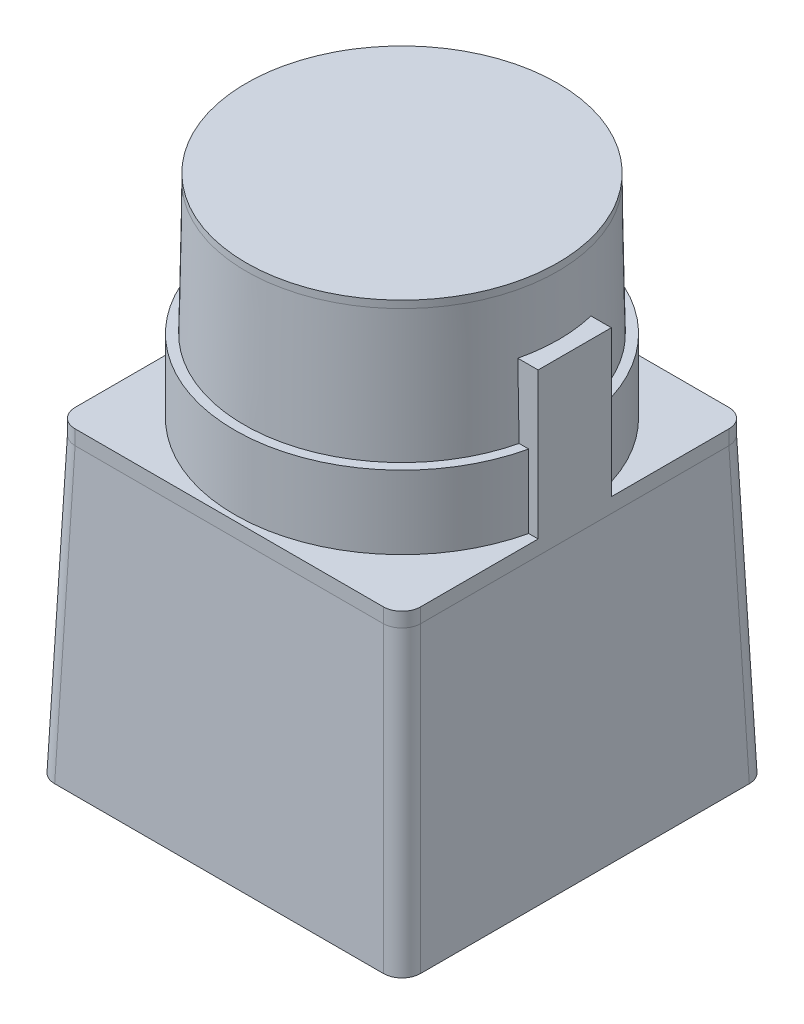
ISO-10303-21;
HEADER;
FILE_DESCRIPTION(('STEP AP214'),'2;1');
FILE_NAME('part.step','',(''),(''),'','','');
FILE_SCHEMA(('AUTOMOTIVE_DESIGN { 1 0 10303 214 1 1 1 1 }'));
ENDSEC;
DATA;
#1=APPLICATION_CONTEXT('core data for automotive mechanical design processes');
#2=APPLICATION_PROTOCOL_DEFINITION('international standard','automotive_design',2000,#1);
#3=PRODUCT_CONTEXT('',#1,'mechanical');
#4=PRODUCT('Part','Part','',(#3));
#5=PRODUCT_RELATED_PRODUCT_CATEGORY('part','',(#4));
#6=PRODUCT_DEFINITION_FORMATION('','',#4);
#7=PRODUCT_DEFINITION_CONTEXT('part definition',#1,'design');
#8=PRODUCT_DEFINITION('design','',#6,#7);
#9=PRODUCT_DEFINITION_SHAPE('','',#8);
#10=(LENGTH_UNIT() NAMED_UNIT(*) SI_UNIT(.MILLI.,.METRE.));
#11=(NAMED_UNIT(*) PLANE_ANGLE_UNIT() SI_UNIT($,.RADIAN.));
#12=(NAMED_UNIT(*) SI_UNIT($,.STERADIAN.) SOLID_ANGLE_UNIT());
#13=UNCERTAINTY_MEASURE_WITH_UNIT(LENGTH_MEASURE(1.E-05),#10,'distance_accuracy_value','');
#14=(GEOMETRIC_REPRESENTATION_CONTEXT(3) GLOBAL_UNCERTAINTY_ASSIGNED_CONTEXT((#13)) GLOBAL_UNIT_ASSIGNED_CONTEXT((#10,
#11,#12)) REPRESENTATION_CONTEXT('',''));
#15=CARTESIAN_POINT('',(0.,0.,0.));
#16=DIRECTION('',(0.,0.,1.));
#17=DIRECTION('',(1.,0.,0.));
#18=AXIS2_PLACEMENT_3D('',#15,#16,#17);
#19=CARTESIAN_POINT('',(-23.6031692274,41.9999999978,23.6031692274));
#20=DIRECTION('',(0.,-1.,0.));
#21=DIRECTION('',(0.,0.,-1.));
#22=AXIS2_PLACEMENT_3D('',#19,#20,#21);
#23=PLANE('',#22);
#24=DIRECTION('',(-1.,0.,0.));
#25=VECTOR('',#24,1.);
#26=CARTESIAN_POINT('',(23.6031692274,41.9999999978,-5.));
#27=LINE('',#26,#25);
#28=CARTESIAN_POINT('',(23.6031692274,41.9999999978,-5.));
#29=VERTEX_POINT('',#28);
#30=CARTESIAN_POINT('',(22.306492328468,41.9999999978,-5.));
#31=VERTEX_POINT('',#30);
#32=EDGE_CURVE('E62',#29,#31,#27,.T.);
#33=ORIENTED_EDGE('',*,*,#32,.F.);
#34=DIRECTION('',(0.,0.,1.));
#35=VECTOR('',#34,1.);
#36=CARTESIAN_POINT('',(23.6031692274,41.9999999978,0.));
#37=LINE('',#36,#35);
#38=CARTESIAN_POINT('',(23.6031692274,41.9999999978,-21.0631692274));
#39=VERTEX_POINT('',#38);
#40=EDGE_CURVE('E223',#39,#29,#37,.T.);
#41=ORIENTED_EDGE('',*,*,#40,.F.);
#42=CARTESIAN_POINT('',(21.0631692274,41.9999999978,-21.0631692274));
#43=DIRECTION('',(0.,-1.,0.));
#44=DIRECTION('',(1.,0.,0.));
#45=AXIS2_PLACEMENT_3D('',#42,#43,#44);
#46=CIRCLE('',#45,2.54);
#47=CARTESIAN_POINT('',(21.0631692274,41.9999999978,-23.6031692274));
#48=VERTEX_POINT('',#47);
#49=EDGE_CURVE('E327',#48,#39,#46,.T.);
#50=ORIENTED_EDGE('',*,*,#49,.F.);
#51=DIRECTION('',(1.,0.,0.));
#52=VECTOR('',#51,1.);
#53=CARTESIAN_POINT('',(0.,41.9999999978,-23.6031692274));
#54=LINE('',#53,#52);
#55=CARTESIAN_POINT('',(-21.0631692274,41.9999999978,-23.6031692274));
#56=VERTEX_POINT('',#55);
#57=EDGE_CURVE('E329',#56,#48,#54,.T.);
#58=ORIENTED_EDGE('',*,*,#57,.F.);
#59=CARTESIAN_POINT('',(-21.0631692274,41.9999999978,-21.0631692274));
#60=DIRECTION('',(0.,-1.,0.));
#61=DIRECTION('',(1.,0.,0.));
#62=AXIS2_PLACEMENT_3D('',#59,#60,#61);
#63=CIRCLE('',#62,2.54);
#64=CARTESIAN_POINT('',(-23.6031692274,41.9999999978,-21.0631692269114));
#65=VERTEX_POINT('',#64);
#66=EDGE_CURVE('E330',#65,#56,#63,.T.);
#67=ORIENTED_EDGE('',*,*,#66,.F.);
#68=DIRECTION('',(0.,0.,-1.));
#69=VECTOR('',#68,1.);
#70=CARTESIAN_POINT('',(-23.6031692274,41.9999999978,0.));
#71=LINE('',#70,#69);
#72=CARTESIAN_POINT('',(-23.6031692274,41.9999999978,21.0631692274));
#73=VERTEX_POINT('',#72);
#74=EDGE_CURVE('E332',#73,#65,#71,.T.);
#75=ORIENTED_EDGE('',*,*,#74,.F.);
#76=CARTESIAN_POINT('',(-21.0631692274,41.9999999978,21.0631692274));
#77=DIRECTION('',(0.,-1.,0.));
#78=DIRECTION('',(1.,0.,0.));
#79=AXIS2_PLACEMENT_3D('',#76,#77,#78);
#80=CIRCLE('',#79,2.54);
#81=CARTESIAN_POINT('',(-21.063169227921,41.9999999978,23.6031692274));
#82=VERTEX_POINT('',#81);
#83=EDGE_CURVE('E333',#82,#73,#80,.T.);
#84=ORIENTED_EDGE('',*,*,#83,.F.);
#85=DIRECTION('',(-1.,0.,0.));
#86=VECTOR('',#85,1.);
#87=CARTESIAN_POINT('',(0.,41.9999999978,23.6031692274));
#88=LINE('',#87,#86);
#89=CARTESIAN_POINT('',(21.0631692274,41.9999999978,23.6031692274));
#90=VERTEX_POINT('',#89);
#91=EDGE_CURVE('E335',#90,#82,#88,.T.);
#92=ORIENTED_EDGE('',*,*,#91,.F.);
#93=CARTESIAN_POINT('',(21.0631692274,41.9999999978,21.0631692274));
#94=DIRECTION('',(0.,-1.,0.));
#95=DIRECTION('',(1.,0.,0.));
#96=AXIS2_PLACEMENT_3D('',#93,#94,#95);
#97=CIRCLE('',#96,2.54);
#98=CARTESIAN_POINT('',(23.6031692274,41.9999999978,21.0631692274));
#99=VERTEX_POINT('',#98);
#100=EDGE_CURVE('E336',#99,#90,#97,.T.);
#101=ORIENTED_EDGE('',*,*,#100,.F.);
#102=CARTESIAN_POINT('',(23.6031692274,41.9999999978,5.));
#103=VERTEX_POINT('',#102);
#104=EDGE_CURVE('E55',#103,#99,#37,.T.);
#105=ORIENTED_EDGE('',*,*,#104,.F.);
#106=DIRECTION('',(1.,0.,0.));
#107=VECTOR('',#106,1.);
#108=CARTESIAN_POINT('',(23.6031692274,41.9999999978,5.));
#109=LINE('',#108,#107);
#110=CARTESIAN_POINT('',(22.306492328468,41.9999999978,5.));
#111=VERTEX_POINT('',#110);
#112=EDGE_CURVE('E219',#111,#103,#109,.T.);
#113=ORIENTED_EDGE('',*,*,#112,.F.);
#114=CARTESIAN_POINT('',(0.,41.9999999978,0.));
#115=DIRECTION('',(0.,-1.,0.));
#116=DIRECTION('',(0.,0.,-1.));
#117=AXIS2_PLACEMENT_3D('',#114,#115,#116);
#118=CIRCLE('',#117,22.86);
#119=EDGE_CURVE('E325',#111,#31,#118,.T.);
#120=ORIENTED_EDGE('',*,*,#119,.T.);
#121=EDGE_LOOP('',(#33,#41,#50,#58,#67,#75,#84,#92,#101,#105,#113,#120));
#122=FACE_BOUND('',#121,.T.);
#123=ADVANCED_FACE('F34',(#122),#23,.F.);
#124=CARTESIAN_POINT('',(0.,51.9999999876,0.));
#125=DIRECTION('',(0.,-1.,0.));
#126=DIRECTION('',(0.,0.,-1.));
#127=AXIS2_PLACEMENT_3D('',#124,#125,#126);
#128=CYLINDRICAL_SURFACE('',#127,22.86);
#129=DIRECTION('',(0.,-1.,0.));
#130=VECTOR('',#129,1.);
#131=CARTESIAN_POINT('',(22.306492328468,51.9999999876,-5.));
#132=LINE('',#131,#130);
#133=CARTESIAN_POINT('',(22.306492328468,51.9999999876,-5.));
#134=VERTEX_POINT('',#133);
#135=EDGE_CURVE('E236',#31,#134,#132,.F.);
#136=ORIENTED_EDGE('',*,*,#135,.F.);
#137=ORIENTED_EDGE('',*,*,#119,.F.);
#138=DIRECTION('',(0.,-1.,0.));
#139=VECTOR('',#138,1.);
#140=CARTESIAN_POINT('',(22.306492328468,51.9999999876,5.));
#141=LINE('',#140,#139);
#142=CARTESIAN_POINT('',(22.306492328468,51.9999999876,5.));
#143=VERTEX_POINT('',#142);
#144=EDGE_CURVE('E227',#143,#111,#141,.T.);
#145=ORIENTED_EDGE('',*,*,#144,.F.);
#146=CARTESIAN_POINT('',(0.,51.9999999876,0.));
#147=DIRECTION('',(0.,-1.,0.));
#148=DIRECTION('',(0.,0.,-1.));
#149=AXIS2_PLACEMENT_3D('',#146,#147,#148);
#150=CIRCLE('',#149,22.86);
#151=EDGE_CURVE('E321',#134,#143,#150,.F.);
#152=ORIENTED_EDGE('',*,*,#151,.F.);
#153=EDGE_LOOP('',(#136,#137,#145,#152));
#154=FACE_BOUND('',#153,.T.);
#155=ADVANCED_FACE('F590',(#154),#128,.T.);
#156=CARTESIAN_POINT('',(-23.13432,51.9999999876,-23.13432));
#157=DIRECTION('',(0.,1.,0.));
#158=DIRECTION('',(0.,0.,1.));
#159=AXIS2_PLACEMENT_3D('',#156,#157,#158);
#160=PLANE('',#159);
#161=CARTESIAN_POINT('',(0.,51.9999999876,0.));
#162=DIRECTION('',(0.,-1.,0.));
#163=DIRECTION('',(0.,0.,-1.));
#164=AXIS2_PLACEMENT_3D('',#161,#162,#163);
#165=CIRCLE('',#164,21.59);
#166=CARTESIAN_POINT('',(21.0030497785441,51.9999999876,5.));
#167=VERTEX_POINT('',#166);
#168=CARTESIAN_POINT('',(21.0030497785441,51.9999999876,-5.));
#169=VERTEX_POINT('',#168);
#170=EDGE_CURVE('E316',#167,#169,#165,.T.);
#171=ORIENTED_EDGE('',*,*,#170,.T.);
#172=DIRECTION('',(1.,0.,0.));
#173=VECTOR('',#172,1.);
#174=CARTESIAN_POINT('',(-23.13432,51.9999999876,-4.99999999999999));
#175=LINE('',#174,#173);
#176=EDGE_CURVE('E234',#169,#134,#175,.T.);
#177=ORIENTED_EDGE('',*,*,#176,.T.);
#178=ORIENTED_EDGE('',*,*,#151,.T.);
#179=DIRECTION('',(-1.,0.,0.));
#180=VECTOR('',#179,1.);
#181=CARTESIAN_POINT('',(-23.13432,51.9999999876,5.));
#182=LINE('',#181,#180);
#183=EDGE_CURVE('E224',#143,#167,#182,.T.);
#184=ORIENTED_EDGE('',*,*,#183,.T.);
#185=EDGE_LOOP('',(#171,#177,#178,#184));
#186=FACE_BOUND('',#185,.T.);
#187=ADVANCED_FACE('F595',(#186),#160,.T.);
#188=CARTESIAN_POINT('',(0.,70.0000000048,0.));
#189=DIRECTION('',(0.,-1.,0.));
#190=DIRECTION('',(0.,0.,-1.));
#191=AXIS2_PLACEMENT_3D('',#188,#189,#190);
#192=CONICAL_SURFACE('',#191,21.2758088326,0.0174532924306293);
#193=CARTESIAN_POINT('',(0.,70.0000000048,0.));
#194=DIRECTION('',(0.,-1.,0.));
#195=DIRECTION('',(0.,0.,-1.));
#196=AXIS2_PLACEMENT_3D('',#193,#194,#195);
#197=CIRCLE('',#196,21.2758088326);
#198=CARTESIAN_POINT('',(0.,70.0000000048,-21.2758088326));
#199=VERTEX_POINT('',#198);
#200=EDGE_CURVE('E310',#199,#199,#197,.T.);
#201=ORIENTED_EDGE('',*,*,#200,.T.);
#202=EDGE_LOOP('',(#201));
#203=FACE_BOUND('',#202,.T.);
#204=CARTESIAN_POINT('',(21.4118588894712,29.2043831627307,-5.));
#205=CARTESIAN_POINT('',(21.2680430061588,37.2279177932147,-5.));
#206=CARTESIAN_POINT('',(21.124147465659,45.2514509943208,-5.));
#207=CARTESIAN_POINT('',(20.8361970702838,61.2985145378097,-5.));
#208=CARTESIAN_POINT('',(20.6921422154084,69.3220448801925,-5.));
#209=CARTESIAN_POINT('',(20.5480077033457,77.3455737931973,-5.));
#210=B_SPLINE_CURVE_WITH_KNOTS('',3,(#204,#205,#206,#207,#208,#209),.UNSPECIFIED.,.F.,.F.,(4,2,
4),(0.,24.0744702662893,48.1489405326763),.UNSPECIFIED.);
#211=CARTESIAN_POINT('',(20.8235796856304,61.9999999978,-5.));
#212=VERTEX_POINT('',#211);
#213=EDGE_CURVE('E11',#169,#212,#210,.T.);
#214=ORIENTED_EDGE('',*,*,#213,.F.);
#215=ORIENTED_EDGE('',*,*,#170,.F.);
#216=CARTESIAN_POINT('',(20.5480077033457,77.3455737931973,5.));
#217=CARTESIAN_POINT('',(20.6921422154084,69.3220448801925,5.));
#218=CARTESIAN_POINT('',(20.8361970702838,61.2985145378097,5.));
#219=CARTESIAN_POINT('',(21.1241474656589,45.2514509943208,5.));
#220=CARTESIAN_POINT('',(21.2680430061588,37.2279177932147,5.));
#221=CARTESIAN_POINT('',(21.4118588894712,29.2043831627307,5.));
#222=B_SPLINE_CURVE_WITH_KNOTS('',3,(#216,#217,#218,#219,#220,#221),.UNSPECIFIED.,.F.,.F.,(4,2,
4),(0.,24.074470266387,48.1489405326763),.UNSPECIFIED.);
#223=CARTESIAN_POINT('',(20.8235796856304,61.9999999978,5.));
#224=VERTEX_POINT('',#223);
#225=EDGE_CURVE('E48',#224,#167,#222,.T.);
#226=ORIENTED_EDGE('',*,*,#225,.F.);
#227=CARTESIAN_POINT('',(0.,61.9999999978,0.));
#228=DIRECTION('',(0.,-1.,0.));
#229=DIRECTION('',(0.,0.,-1.));
#230=AXIS2_PLACEMENT_3D('',#227,#228,#229);
#231=CIRCLE('',#230,21.4154493514332);
#232=EDGE_CURVE('E418',#212,#224,#231,.T.);
#233=ORIENTED_EDGE('',*,*,#232,.F.);
#234=EDGE_LOOP('',(#214,#215,#226,#233));
#235=FACE_BOUND('',#234,.T.);
#236=ADVANCED_FACE('F398',(#203,#235),#192,.T.);
#237=CARTESIAN_POINT('',(-25.0000000126,0.,-25.0000000126));
#238=DIRECTION('',(0.,1.,0.));
#239=DIRECTION('',(0.,0.,1.));
#240=AXIS2_PLACEMENT_3D('',#237,#238,#239);
#241=PLANE('',#240);
#242=CARTESIAN_POINT('',(20.0000000075042,0.,-19.9999999942534));
#243=DIRECTION('',(0.,-1.,0.));
#244=DIRECTION('',(0.,0.,-1.));
#245=AXIS2_PLACEMENT_3D('',#242,#243,#244);
#246=CIRCLE('',#245,1.5);
#247=CARTESIAN_POINT('',(20.0000000075042,0.,-21.4999999942534));
#248=VERTEX_POINT('',#247);
#249=EDGE_CURVE('E239',#248,#248,#246,.T.);
#250=ORIENTED_EDGE('',*,*,#249,.F.);
#251=EDGE_LOOP('',(#250));
#252=FACE_BOUND('',#251,.T.);
#253=CARTESIAN_POINT('',(-20.0000000075042,0.,19.9999999942534));
#254=DIRECTION('',(0.,-1.,0.));
#255=DIRECTION('',(0.,0.,-1.));
#256=AXIS2_PLACEMENT_3D('',#253,#254,#255);
#257=CIRCLE('',#256,1.5000000071763);
#258=CARTESIAN_POINT('',(-20.0000000075042,0.,18.4999999870771));
#259=VERTEX_POINT('',#258);
#260=EDGE_CURVE('E243',#259,#259,#257,.T.);
#261=ORIENTED_EDGE('',*,*,#260,.F.);
#262=EDGE_LOOP('',(#261));
#263=FACE_BOUND('',#262,.T.);
#264=CARTESIAN_POINT('',(22.4584517485526,0.,-22.4584517485526));
#265=DIRECTION('',(0.,1.,0.));
#266=DIRECTION('',(0.707106781186554,0.,-0.707106781186541));
#267=AXIS2_PLACEMENT_3D('',#264,#265,#266);
#268=ELLIPSE('',#267,2.54309555493556,2.54000001245353);
#269=CARTESIAN_POINT('',(22.4615472930611,-9.89321471966953E-11,-25.0000000040941));
#270=VERTEX_POINT('',#269);
#271=CARTESIAN_POINT('',(25.0000000080669,0.,-22.4615472839286));
#272=VERTEX_POINT('',#271);
#273=EDGE_CURVE('E359',#270,#272,#268,.F.);
#274=ORIENTED_EDGE('',*,*,#273,.T.);
#275=DIRECTION('',(0.,0.,-1.));
#276=VECTOR('',#275,1.);
#277=CARTESIAN_POINT('',(25.0000000126,0.,0.));
#278=LINE('',#277,#276);
#279=CARTESIAN_POINT('',(24.9999999966763,0.,22.4615472839147));
#280=VERTEX_POINT('',#279);
#281=EDGE_CURVE('E284',#280,#272,#278,.T.);
#282=ORIENTED_EDGE('',*,*,#281,.F.);
#283=CARTESIAN_POINT('',(22.4584517485526,0.,22.4584517485526));
#284=DIRECTION('',(0.,1.,0.));
#285=DIRECTION('',(0.707106781186541,0.,0.707106781186554));
#286=AXIS2_PLACEMENT_3D('',#283,#284,#285);
#287=ELLIPSE('',#286,2.54309553214044,2.53999998968616);
#288=CARTESIAN_POINT('',(22.4615472839147,0.,24.9999999966763));
#289=VERTEX_POINT('',#288);
#290=EDGE_CURVE('E249',#280,#289,#287,.F.);
#291=ORIENTED_EDGE('',*,*,#290,.T.);
#292=DIRECTION('',(1.,0.,0.));
#293=VECTOR('',#292,1.);
#294=CARTESIAN_POINT('',(0.,0.,25.0000000126));
#295=LINE('',#294,#293);
#296=CARTESIAN_POINT('',(-22.4615473026752,0.,24.999999993184));
#297=VERTEX_POINT('',#296);
#298=EDGE_CURVE('E304',#297,#289,#295,.T.);
#299=ORIENTED_EDGE('',*,*,#298,.F.);
#300=CARTESIAN_POINT('',(-22.4584517573299,0.,22.45845175733));
#301=DIRECTION('',(0.,1.,0.));
#302=DIRECTION('',(-0.707106781186534,0.,0.707106781186561));
#303=AXIS2_PLACEMENT_3D('',#300,#301,#302);
#304=ELLIPSE('',#303,2.54309554092317,2.5399999984582);
#305=CARTESIAN_POINT('',(-25.0000000054537,0.,22.4615472883088));
#306=VERTEX_POINT('',#305);
#307=EDGE_CURVE('E371',#297,#306,#304,.F.);
#308=ORIENTED_EDGE('',*,*,#307,.T.);
#309=DIRECTION('',(0.,0.,1.));
#310=VECTOR('',#309,1.);
#311=CARTESIAN_POINT('',(-25.0000000126,0.,0.));
#312=LINE('',#311,#310);
#313=CARTESIAN_POINT('',(-24.999999993184,0.,-22.4615473026752));
#314=VERTEX_POINT('',#313);
#315=EDGE_CURVE('E299',#314,#306,#312,.T.);
#316=ORIENTED_EDGE('',*,*,#315,.F.);
#317=CARTESIAN_POINT('',(-22.45845175733,0.,-22.4584517573299));
#318=DIRECTION('',(0.,1.,0.));
#319=DIRECTION('',(-0.707106781186562,0.,-0.707106781186533));
#320=AXIS2_PLACEMENT_3D('',#317,#318,#319);
#321=ELLIPSE('',#320,2.54309554092317,2.5399999984582);
#322=CARTESIAN_POINT('',(-22.4615472883088,0.,-25.0000000054537));
#323=VERTEX_POINT('',#322);
#324=EDGE_CURVE('E365',#314,#323,#321,.F.);
#325=ORIENTED_EDGE('',*,*,#324,.T.);
#326=DIRECTION('',(-1.,0.,0.));
#327=VECTOR('',#326,1.);
#328=CARTESIAN_POINT('',(0.,0.,-25.0000000126));
#329=LINE('',#328,#327);
#330=EDGE_CURVE('E294',#270,#323,#329,.T.);
#331=ORIENTED_EDGE('',*,*,#330,.F.);
#332=EDGE_LOOP('',(#274,#282,#291,#299,#308,#316,#325,#331));
#333=FACE_BOUND('',#332,.T.);
#334=ADVANCED_FACE('F401',(#252,#263,#333),#241,.F.);
#335=CARTESIAN_POINT('',(21.056327374305,40.1515886999986,21.056327374305));
#336=DIRECTION('',(0.0348782627554634,-0.998782765957804,0.034878262755464));
#337=DIRECTION('',(0.,-0.0348994967156143,-0.999390827018638));
#338=AXIS2_PLACEMENT_3D('',#335,#336,#337);
#339=CYLINDRICAL_SURFACE('',#338,2.53999998968616);
#340=CARTESIAN_POINT('',(21.0631692274,39.9556636619195,21.0631692274));
#341=DIRECTION('',(0.0174444406774464,-0.999695645173521,0.0174444406774474));
#342=DIRECTION('',(-0.706891569824864,-0.0246701645940576,-0.70689156982485));
#343=AXIS2_PLACEMENT_3D('',#340,#341,#342);
#344=ELLIPSE('',#343,2.54077329145733,2.53999999484308);
#345=CARTESIAN_POINT('',(23.6031687608156,40.0000132547059,21.0647160031617));
#346=VERTEX_POINT('',#345);
#347=CARTESIAN_POINT('',(21.0647160566723,40.0000132490903,23.6031687500148));
#348=VERTEX_POINT('',#347);
#349=EDGE_CURVE('E351',#346,#348,#344,.T.);
#350=ORIENTED_EDGE('',*,*,#349,.T.);
#351=DIRECTION('',(-0.0348782621516423,0.998782765967756,-0.0348782630743116));
#352=VECTOR('',#351,1.);
#353=CARTESIAN_POINT('',(22.4615472773966,0.,25.0000000126));
#354=LINE('',#353,#352);
#355=EDGE_CURVE('E307',#289,#348,#354,.T.);
#356=ORIENTED_EDGE('',*,*,#355,.F.);
#357=ORIENTED_EDGE('',*,*,#290,.F.);
#358=DIRECTION('',(0.0348782630743116,-0.998782765967756,0.0348782621516423));
#359=VECTOR('',#358,1.);
#360=CARTESIAN_POINT('',(23.6031687487904,40.0000134836286,21.0647160505388));
#361=LINE('',#360,#359);
#362=EDGE_CURVE('E354',#346,#280,#361,.T.);
#363=ORIENTED_EDGE('',*,*,#362,.F.);
#364=EDGE_LOOP('',(#350,#356,#357,#363));
#365=FACE_BOUND('',#364,.T.);
#366=ADVANCED_FACE('F571',(#365),#339,.T.);
#367=CARTESIAN_POINT('',(-22.731085856,40.2400135762,23.5947877608));
#368=DIRECTION('',(0.,0.0348994970339201,0.999390827007522));
#369=DIRECTION('',(0.,-0.999390827007522,0.0348994970339201));
#370=AXIS2_PLACEMENT_3D('',#367,#368,#369);
#371=PLANE('',#370);
#372=DIRECTION('',(1.,0.,0.));
#373=VECTOR('',#372,1.);
#374=CARTESIAN_POINT('',(-22.731085856,40.0000067434264,23.6031689841634));
#375=LINE('',#374,#373);
#376=CARTESIAN_POINT('',(-21.0631692142941,40.0000033767132,23.6031691057817));
#377=VERTEX_POINT('',#376);
#378=CARTESIAN_POINT('',(-21.064716171992,40.0000100048208,23.6031688768194));
#379=VERTEX_POINT('',#378);
#380=EDGE_CURVE('E373',#377,#379,#375,.F.);
#381=ORIENTED_EDGE('',*,*,#380,.T.);
#382=DIRECTION('',(0.0348782628698957,0.998782765971677,-0.0348782622437629));
#383=VECTOR('',#382,1.);
#384=CARTESIAN_POINT('',(-21.7637714539054,19.9816859661939,24.3022241483629));
#385=LINE('',#384,#383);
#386=EDGE_CURVE('E370',#379,#297,#385,.F.);
#387=ORIENTED_EDGE('',*,*,#386,.T.);
#388=ORIENTED_EDGE('',*,*,#298,.T.);
#389=ORIENTED_EDGE('',*,*,#355,.T.);
#390=CARTESIAN_POINT('',(21.0647160557825,40.0000134955515,23.6031687564003));
#391=CARTESIAN_POINT('',(21.0646516045644,40.0000129336167,23.6031687956503));
#392=CARTESIAN_POINT('',(21.0645871533449,40.0000123716819,23.6031688324472));
#393=CARTESIAN_POINT('',(21.0644582509032,40.0000112478122,23.6031689011347));
#394=CARTESIAN_POINT('',(21.064393799681,40.0000106858774,23.6031689330253));
#395=CARTESIAN_POINT('',(21.0642648972345,40.0000095620077,23.6031689919003));
#396=CARTESIAN_POINT('',(21.0642004460101,40.0000090000729,23.6031690188847));
#397=CARTESIAN_POINT('',(21.0640715435594,40.0000078762032,23.6031690679471));
#398=CARTESIAN_POINT('',(21.0640070923331,40.0000073142684,23.6031690900253));
#399=CARTESIAN_POINT('',(21.0638781898791,40.0000061903987,23.6031691292752));
#400=CARTESIAN_POINT('',(21.0638137386514,40.0000056284639,23.6031691464471));
#401=CARTESIAN_POINT('',(21.0636848361947,40.0000045045942,23.6031691758846));
#402=CARTESIAN_POINT('',(21.0636203849658,40.0000039426594,23.6031691881502));
#403=CARTESIAN_POINT('',(21.0634914825073,40.0000028187897,23.6031692077751));
#404=CARTESIAN_POINT('',(21.0634270312777,40.0000022568549,23.6031692151345));
#405=CARTESIAN_POINT('',(21.0632981288181,40.0000011329852,23.6031692249469));
#406=CARTESIAN_POINT('',(21.0632336775881,40.0000005710504,23.6031692274));
#407=CARTESIAN_POINT('',(21.0631692263581,40.0000000091156,23.6031692274));
#408=B_SPLINE_CURVE_WITH_KNOTS('',3,(#390,#391,#392,#393,#394,#395,#396,#397,#398,#399,#400,
#401,#402,#403,#404,#405,#406,#407),.UNSPECIFIED.,.F.,.F.,(4,2,2,2,2,2,2,2,4),(0.,
0.000193361038873821,0.000386722077752431,0.000580083116628768,0.000773444155502519,
0.000966805194380497,0.00116016623325558,0.0013535272721311,0.00154688831101022),.UNSPECIFIED.);
#409=CARTESIAN_POINT('',(21.0631692270527,40.0000000097052,23.6031692274));
#410=VERTEX_POINT('',#409);
#411=EDGE_CURVE('E282',#348,#410,#408,.T.);
#412=ORIENTED_EDGE('',*,*,#411,.T.);
#413=DIRECTION('',(-1.,0.,0.));
#414=VECTOR('',#413,1.);
#415=CARTESIAN_POINT('',(0.,40.00000001,23.6031692274));
#416=LINE('',#415,#414);
#417=EDGE_CURVE('E447',#410,#377,#416,.T.);
#418=ORIENTED_EDGE('',*,*,#417,.T.);
#419=EDGE_LOOP('',(#381,#387,#388,#389,#412,#418));
#420=FACE_BOUND('',#419,.T.);
#421=ADVANCED_FACE('F578',(#420),#371,.T.);
#422=CARTESIAN_POINT('',(-21.056327383061,40.1515887006102,21.056327383061));
#423=DIRECTION('',(-0.0348782627554633,-0.998782765957804,0.0348782627554647));
#424=DIRECTION('',(0.,-0.034899496715615,-0.999390827018638));
#425=AXIS2_PLACEMENT_3D('',#422,#423,#424);
#426=CYLINDRICAL_SURFACE('',#425,2.5399999984582);
#427=CARTESIAN_POINT('',(-21.0631692274,39.9556639132704,21.0631692274));
#428=DIRECTION('',(-0.0174444406774478,-0.999695645173521,0.0174444406774478));
#429=DIRECTION('',(0.70689156982483,-0.0246701645940583,-0.706891569824885));
#430=AXIS2_PLACEMENT_3D('',#427,#428,#429);
#431=ELLIPSE('',#430,2.54077329584468,2.5399999992291);
#432=CARTESIAN_POINT('',(-23.6031687522092,40.0000133747624,21.0647160542866));
#433=VERTEX_POINT('',#432);
#434=EDGE_CURVE('E347',#379,#433,#431,.T.);
#435=ORIENTED_EDGE('',*,*,#434,.T.);
#436=DIRECTION('',(0.0348782630743116,0.998782765967756,-0.0348782621516423));
#437=VECTOR('',#436,1.);
#438=CARTESIAN_POINT('',(-25.0000000126,0.,22.4615472773966));
#439=LINE('',#438,#437);
#440=EDGE_CURVE('E302',#306,#433,#439,.T.);
#441=ORIENTED_EDGE('',*,*,#440,.F.);
#442=ORIENTED_EDGE('',*,*,#307,.F.);
#443=ORIENTED_EDGE('',*,*,#386,.F.);
#444=EDGE_LOOP('',(#435,#441,#442,#443));
#445=FACE_BOUND('',#444,.T.);
#446=ADVANCED_FACE('F580',(#445),#426,.T.);
#447=CARTESIAN_POINT('',(-23.5947877608,40.2400135762,-22.731085856));
#448=DIRECTION('',(-0.999390827007522,0.0348994970339201,0.));
#449=DIRECTION('',(-0.0348994970339201,-0.999390827007522,0.));
#450=AXIS2_PLACEMENT_3D('',#447,#448,#449);
#451=PLANE('',#450);
#452=ORIENTED_EDGE('',*,*,#440,.T.);
#453=CARTESIAN_POINT('',(-23.6031687564007,40.0000134955515,21.0647160552615));
#454=CARTESIAN_POINT('',(-23.6031687956506,40.0000129336167,21.0646516041493));
#455=CARTESIAN_POINT('',(-23.6031688324474,40.0000123716819,21.0645871530356));
#456=CARTESIAN_POINT('',(-23.6031689011348,40.0000112478122,21.0644582508055));
#457=CARTESIAN_POINT('',(-23.6031689330253,40.0000106858774,21.0643937996892));
#458=CARTESIAN_POINT('',(-23.6031689919002,40.0000095620077,21.0642648974543));
#459=CARTESIAN_POINT('',(-23.6031690188845,40.0000090000729,21.0642004463358));
#460=CARTESIAN_POINT('',(-23.603169067947,40.0000078762032,21.0640715440968));
#461=CARTESIAN_POINT('',(-23.603169090025,40.0000073142684,21.0640070929763));
#462=CARTESIAN_POINT('',(-23.603169129275,40.0000061903987,21.063878190734));
#463=CARTESIAN_POINT('',(-23.6031691464468,40.0000056284639,21.0638137396121));
#464=CARTESIAN_POINT('',(-23.6031691758843,40.0000045045942,21.0636848373671));
#465=CARTESIAN_POINT('',(-23.6031691881499,40.0000039426594,21.063620386244));
#466=CARTESIAN_POINT('',(-23.6031692077749,40.0000028187897,21.0634914839972));
#467=CARTESIAN_POINT('',(-23.6031692151343,40.0000022568549,21.0634270328734));
#468=CARTESIAN_POINT('',(-23.6031692249468,40.0000011329852,21.0632981306254));
#469=CARTESIAN_POINT('',(-23.6031692274,40.0000005710504,21.0632336795013));
#470=CARTESIAN_POINT('',(-23.6031692274,40.0000000091156,21.0631692283771));
#471=B_SPLINE_CURVE_WITH_KNOTS('',3,(#453,#454,#455,#456,#457,#458,#459,#460,#461,#462,#463,
#464,#465,#466,#467,#468,#469,#470),.UNSPECIFIED.,.F.,.F.,(4,2,2,2,2,2,2,2,4),(0.,
0.000193360721389789,0.000386721442777458,0.000580082164166343,0.000773442885552659,
0.000966803606943213,0.00116016432833087,0.00135352504971897,0.0015468857711072),.UNSPECIFIED.);
#472=CARTESIAN_POINT('',(-23.6031692274,40.0000000097052,21.0631692277257));
#473=VERTEX_POINT('',#472);
#474=EDGE_CURVE('E349',#433,#473,#471,.T.);
#475=ORIENTED_EDGE('',*,*,#474,.T.);
#476=DIRECTION('',(0.,0.,-1.));
#477=VECTOR('',#476,1.);
#478=CARTESIAN_POINT('',(-23.6031692274,40.00000001,0.));
#479=LINE('',#478,#477);
#480=CARTESIAN_POINT('',(-23.6031691057817,40.0000033767132,-21.0631692132846));
#481=VERTEX_POINT('',#480);
#482=EDGE_CURVE('E439',#473,#481,#479,.T.);
#483=ORIENTED_EDGE('',*,*,#482,.T.);
#484=DIRECTION('',(0.,0.,1.));
#485=VECTOR('',#484,1.);
#486=CARTESIAN_POINT('',(-23.6031689841634,40.0000067434264,-22.731085856));
#487=LINE('',#486,#485);
#488=CARTESIAN_POINT('',(-23.6031688768194,40.0000100048208,-21.064716171992));
#489=VERTEX_POINT('',#488);
#490=EDGE_CURVE('E303',#481,#489,#487,.F.);
#491=ORIENTED_EDGE('',*,*,#490,.T.);
#492=DIRECTION('',(0.0348782622437629,0.998782765971677,0.0348782628698958));
#493=VECTOR('',#492,1.);
#494=CARTESIAN_POINT('',(-24.3022241483629,19.9816859661939,-21.7637714539055));
#495=LINE('',#494,#493);
#496=EDGE_CURVE('E364',#489,#314,#495,.F.);
#497=ORIENTED_EDGE('',*,*,#496,.T.);
#498=ORIENTED_EDGE('',*,*,#315,.T.);
#499=EDGE_LOOP('',(#452,#475,#483,#491,#497,#498));
#500=FACE_BOUND('',#499,.T.);
#501=ADVANCED_FACE('F510',(#500),#451,.T.);
#502=CARTESIAN_POINT('',(-21.056327383061,40.1515887006102,-21.056327383061));
#503=DIRECTION('',(-0.0348782627554647,-0.998782765957804,-0.0348782627554633));
#504=DIRECTION('',(0.999390827018638,-0.034899496715615,0.));
#505=AXIS2_PLACEMENT_3D('',#502,#503,#504);
#506=CYLINDRICAL_SURFACE('',#505,2.5399999984582);
#507=CARTESIAN_POINT('',(-21.0631692274,39.9556639132704,-21.0631692274));
#508=DIRECTION('',(-0.0174444406774485,-0.999695645173521,-0.0174444406774471));
#509=DIRECTION('',(0.706891569824857,-0.0246701645940583,0.706891569824857));
#510=AXIS2_PLACEMENT_3D('',#507,#508,#509);
#511=ELLIPSE('',#510,2.54077329584468,2.5399999992291);
#512=CARTESIAN_POINT('',(-21.0647160540913,40.000013374759,-23.6031687522093));
#513=VERTEX_POINT('',#512);
#514=EDGE_CURVE('E343',#489,#513,#511,.T.);
#515=ORIENTED_EDGE('',*,*,#514,.T.);
#516=DIRECTION('',(0.0348782621516425,0.998782765967756,0.0348782630743116));
#517=VECTOR('',#516,1.);
#518=CARTESIAN_POINT('',(-22.4615472773966,0.,-25.0000000126));
#519=LINE('',#518,#517);
#520=EDGE_CURVE('E297',#323,#513,#519,.T.);
#521=ORIENTED_EDGE('',*,*,#520,.F.);
#522=ORIENTED_EDGE('',*,*,#324,.F.);
#523=ORIENTED_EDGE('',*,*,#496,.F.);
#524=EDGE_LOOP('',(#515,#521,#522,#523));
#525=FACE_BOUND('',#524,.T.);
#526=ADVANCED_FACE('F557',(#525),#506,.T.);
#527=CARTESIAN_POINT('',(-22.731085856,0.,-25.0000000126));
#528=DIRECTION('',(0.,0.0348994970339201,-0.999390827007522));
#529=DIRECTION('',(0.,0.999390827007522,0.0348994970339201));
#530=AXIS2_PLACEMENT_3D('',#527,#528,#529);
#531=PLANE('',#530);
#532=ORIENTED_EDGE('',*,*,#520,.T.);
#533=CARTESIAN_POINT('',(-21.0647160547405,40.0000134955515,-23.603168756401));
#534=CARTESIAN_POINT('',(-21.0646516036283,40.0000129336167,-23.6031687956509));
#535=CARTESIAN_POINT('',(-21.0645871525146,40.0000123716819,-23.6031688324477));
#536=CARTESIAN_POINT('',(-21.0644582502846,40.0000112478122,-23.603168901135));
#537=CARTESIAN_POINT('',(-21.0643937991683,40.0000106858774,-23.6031689330256));
#538=CARTESIAN_POINT('',(-21.0642648969334,40.0000095620077,-23.6031689919004));
#539=CARTESIAN_POINT('',(-21.0642004458148,40.0000090000729,-23.6031690188847));
#540=CARTESIAN_POINT('',(-21.0640715435758,40.0000078762032,-23.6031690679471));
#541=CARTESIAN_POINT('',(-21.0640070924554,40.0000073142684,-23.6031690900252));
#542=CARTESIAN_POINT('',(-21.063878190213,40.0000061903987,-23.6031691292751));
#543=CARTESIAN_POINT('',(-21.0638137390911,40.0000056284639,-23.603169146447));
#544=CARTESIAN_POINT('',(-21.0636848368461,40.0000045045942,-23.6031691758844));
#545=CARTESIAN_POINT('',(-21.0636203857231,40.0000039426594,-23.60316918815));
#546=CARTESIAN_POINT('',(-21.0634914834762,40.0000028187897,-23.603169207775));
#547=CARTESIAN_POINT('',(-21.0634270323525,40.0000022568549,-23.6031692151344));
#548=CARTESIAN_POINT('',(-21.0632981301045,40.0000011329852,-23.6031692249469));
#549=CARTESIAN_POINT('',(-21.0632336789803,40.0000005710504,-23.6031692274));
#550=CARTESIAN_POINT('',(-21.0631692278562,40.0000000091156,-23.6031692274));
#551=B_SPLINE_CURVE_WITH_KNOTS('',3,(#533,#534,#535,#536,#537,#538,#539,#540,#541,#542,#543,
#544,#545,#546,#547,#548,#549,#550),.UNSPECIFIED.,.F.,.F.,(4,2,2,2,2,2,2,2,4),(0.,
0.000193360721389768,0.000386721442777418,0.000580082164166286,0.000773442885556058,
0.000966803606943131,0.00116016432833078,0.00135352504971888,0.0015468857711071),.UNSPECIFIED.);
#552=CARTESIAN_POINT('',(-21.0631692275521,40.0000000097052,-23.6031692274));
#553=VERTEX_POINT('',#552);
#554=EDGE_CURVE('E345',#513,#553,#551,.T.);
#555=ORIENTED_EDGE('',*,*,#554,.T.);
#556=DIRECTION('',(1.,0.,0.));
#557=VECTOR('',#556,1.);
#558=CARTESIAN_POINT('',(0.,40.00000001,-23.6031692274));
#559=LINE('',#558,#557);
#560=CARTESIAN_POINT('',(21.0631692137731,40.0000033767132,-23.6031691057817));
#561=VERTEX_POINT('',#560);
#562=EDGE_CURVE('E431',#553,#561,#559,.T.);
#563=ORIENTED_EDGE('',*,*,#562,.T.);
#564=DIRECTION('',(1.,0.,0.));
#565=VECTOR('',#564,1.);
#566=CARTESIAN_POINT('',(-22.731085856,40.0000067434264,-23.6031689841634));
#567=LINE('',#566,#565);
#568=CARTESIAN_POINT('',(21.0647161724307,40.0000098792158,-23.6031688791392));
#569=VERTEX_POINT('',#568);
#570=EDGE_CURVE('E298',#561,#569,#567,.T.);
#571=ORIENTED_EDGE('',*,*,#570,.T.);
#572=DIRECTION('',(-0.034878262641792,0.998782765965743,0.034878262641792));
#573=VECTOR('',#572,1.);
#574=CARTESIAN_POINT('',(21.7637714457,19.9816859573,-24.3022241539));
#575=LINE('',#574,#573);
#576=EDGE_CURVE('E293',#569,#270,#575,.F.);
#577=ORIENTED_EDGE('',*,*,#576,.T.);
#578=ORIENTED_EDGE('',*,*,#330,.T.);
#579=EDGE_LOOP('',(#532,#555,#563,#571,#577,#578));
#580=FACE_BOUND('',#579,.T.);
#581=ADVANCED_FACE('F548',(#580),#531,.T.);
#582=CARTESIAN_POINT('',(21.056327374627,40.1515886907769,-21.056327374627));
#583=DIRECTION('',(0.0348782627554634,-0.998782765957804,-0.0348782627554628));
#584=DIRECTION('',(0.999390827018638,0.0348994967156137,0.));
#585=AXIS2_PLACEMENT_3D('',#582,#583,#584);
#586=CYLINDRICAL_SURFACE('',#585,2.54000001245353);
#587=CARTESIAN_POINT('',(21.0631692274,39.9556636619194,-21.0631692274));
#588=DIRECTION('',(0.0174444406774464,-0.999695645173521,-0.0174444406774468));
#589=DIRECTION('',(-0.706891569824877,-0.024670164594058,0.706891569824837));
#590=AXIS2_PLACEMENT_3D('',#587,#588,#589);
#591=ELLIPSE('',#590,2.54077330284448,2.54000000622677);
#592=CARTESIAN_POINT('',(23.6031687557078,40.0000132491553,-21.0647160547078));
#593=VERTEX_POINT('',#592);
#594=EDGE_CURVE('E339',#569,#593,#591,.T.);
#595=ORIENTED_EDGE('',*,*,#594,.T.);
#596=DIRECTION('',(-0.0348782630743116,0.998782765967756,0.0348782621516425));
#597=VECTOR('',#596,1.);
#598=CARTESIAN_POINT('',(25.0000000126,0.,-22.4615472773966));
#599=LINE('',#598,#597);
#600=EDGE_CURVE('E292',#272,#593,#599,.T.);
#601=ORIENTED_EDGE('',*,*,#600,.F.);
#602=ORIENTED_EDGE('',*,*,#273,.F.);
#603=ORIENTED_EDGE('',*,*,#576,.F.);
#604=EDGE_LOOP('',(#595,#601,#602,#603));
#605=FACE_BOUND('',#604,.T.);
#606=ADVANCED_FACE('F267',(#605),#586,.T.);
#607=CARTESIAN_POINT('',(25.0000000126,0.,-22.731085856));
#608=DIRECTION('',(0.999390827007522,0.0348994970339201,0.));
#609=DIRECTION('',(-0.0348994970339201,0.999390827007522,0.));
#610=AXIS2_PLACEMENT_3D('',#607,#608,#609);
#611=PLANE('',#610);
#612=CARTESIAN_POINT('',(23.6031692274,40.0000000091156,21.063169227921));
#613=CARTESIAN_POINT('',(23.6031692274,40.0000005710504,21.0632336790451));
#614=CARTESIAN_POINT('',(23.6031692249469,40.0000011329852,21.0632981301693));
#615=CARTESIAN_POINT('',(23.6031692151344,40.0000022568549,21.0634270324173));
#616=CARTESIAN_POINT('',(23.603169207775,40.0000028187897,21.063491483541));
#617=CARTESIAN_POINT('',(23.60316918815,40.0000039426594,21.0636203857879));
#618=CARTESIAN_POINT('',(23.6031691758844,40.0000045045942,21.0636848369109));
#619=CARTESIAN_POINT('',(23.603169146447,40.0000056284639,21.0638137391559));
#620=CARTESIAN_POINT('',(23.6031691292751,40.0000061903987,21.0638781902778));
#621=CARTESIAN_POINT('',(23.6031690900252,40.0000073142684,21.0640070925202));
#622=CARTESIAN_POINT('',(23.6031690679471,40.0000078762032,21.0640715436406));
#623=CARTESIAN_POINT('',(23.6031690188847,40.0000090000729,21.0642004458796));
#624=CARTESIAN_POINT('',(23.6031689919004,40.0000095620077,21.0642648969982));
#625=CARTESIAN_POINT('',(23.6031689330255,40.0000106858774,21.0643937992331));
#626=CARTESIAN_POINT('',(23.603168901135,40.0000112478122,21.0644582503494));
#627=CARTESIAN_POINT('',(23.6031688324476,40.0000123716819,21.0645871525794));
#628=CARTESIAN_POINT('',(23.6031687956508,40.0000129336167,21.0646516036931));
#629=CARTESIAN_POINT('',(23.6031687564009,40.0000134955515,21.0647160548054));
#630=B_SPLINE_CURVE_WITH_KNOTS('',3,(#612,#613,#614,#615,#616,#617,#618,#619,#620,#621,#622,
#623,#624,#625,#626,#627,#628,#629),.UNSPECIFIED.,.F.,.F.,(4,2,2,2,2,2,2,2,4),(0.,
0.000193360721388226,0.000386721442776322,0.000580082164167444,0.000773442885554518,
0.000966803606940823,0.00116016432833316,0.00135352504972081,0.00154688577110711),.UNSPECIFIED.);
#631=CARTESIAN_POINT('',(23.6031692274,40.0000000097052,21.0631692230314));
#632=VERTEX_POINT('',#631);
#633=EDGE_CURVE('E353',#632,#346,#630,.T.);
#634=ORIENTED_EDGE('',*,*,#633,.T.);
#635=ORIENTED_EDGE('',*,*,#362,.T.);
#636=ORIENTED_EDGE('',*,*,#281,.T.);
#637=ORIENTED_EDGE('',*,*,#600,.T.);
#638=CARTESIAN_POINT('',(23.6031687564,40.0000134955515,-21.0647160563034));
#639=CARTESIAN_POINT('',(23.60316879565,40.0000129336167,-21.0646516050854));
#640=CARTESIAN_POINT('',(23.6031688324469,40.0000123716819,-21.0645871538658));
#641=CARTESIAN_POINT('',(23.6031689011344,40.0000112478122,-21.0644582514241));
#642=CARTESIAN_POINT('',(23.6031689330251,40.0000106858774,-21.064393800202));
#643=CARTESIAN_POINT('',(23.6031689919001,40.0000095620077,-21.0642648977554));
#644=CARTESIAN_POINT('',(23.6031690188845,40.0000090000729,-21.064200446531));
#645=CARTESIAN_POINT('',(23.603169067947,40.0000078762032,-21.0640715440804));
#646=CARTESIAN_POINT('',(23.6031690900251,40.0000073142684,-21.0640070928541));
#647=CARTESIAN_POINT('',(23.6031691292751,40.0000061903987,-21.0638781904001));
#648=CARTESIAN_POINT('',(23.603169146447,40.0000056284639,-21.0638137391723));
#649=CARTESIAN_POINT('',(23.6031691758845,40.0000045045942,-21.0636848367157));
#650=CARTESIAN_POINT('',(23.6031691881501,40.0000039426594,-21.0636203854868));
#651=CARTESIAN_POINT('',(23.6031692077751,40.0000028187897,-21.0634914830283));
#652=CARTESIAN_POINT('',(23.6031692151344,40.0000022568549,-21.0634270317987));
#653=CARTESIAN_POINT('',(23.6031692249469,40.0000011329852,-21.063298129339));
#654=CARTESIAN_POINT('',(23.6031692274,40.0000005710504,-21.063233678109));
#655=CARTESIAN_POINT('',(23.6031692274,40.0000000091156,-21.063169226879));
#656=B_SPLINE_CURVE_WITH_KNOTS('',3,(#638,#639,#640,#641,#642,#643,#644,#645,#646,#647,#648,
#649,#650,#651,#652,#653,#654,#655),.UNSPECIFIED.,.F.,.F.,(4,2,2,2,2,2,2,2,4),(0.,
0.000193361038877312,0.000386722077752474,0.000580083116628825,0.00077344415550606,
0.000966805194384048,0.00116016623325913,0.00135352727213466,0.00154688831101032),.UNSPECIFIED.);
#657=CARTESIAN_POINT('',(23.6031692274,40.0000000097052,-21.0631692272263));
#658=VERTEX_POINT('',#657);
#659=EDGE_CURVE('E341',#593,#658,#656,.T.);
#660=ORIENTED_EDGE('',*,*,#659,.T.);
#661=DIRECTION('',(0.,0.,1.));
#662=VECTOR('',#661,1.);
#663=CARTESIAN_POINT('',(23.6031692274,40.00000001,0.));
#664=LINE('',#663,#662);
#665=EDGE_CURVE('E338',#658,#632,#664,.T.);
#666=ORIENTED_EDGE('',*,*,#665,.T.);
#667=EDGE_LOOP('',(#634,#635,#636,#637,#660,#666));
#668=FACE_BOUND('',#667,.T.);
#669=ADVANCED_FACE('F567',(#668),#611,.T.);
#670=CARTESIAN_POINT('',(21.0631692274,41.9999999978,21.0631692274));
#671=DIRECTION('',(0.,-1.,0.));
#672=DIRECTION('',(1.,0.,0.));
#673=AXIS2_PLACEMENT_3D('',#670,#671,#672);
#674=CYLINDRICAL_SURFACE('',#673,2.54);
#675=DIRECTION('',(0.,-1.,0.));
#676=VECTOR('',#675,1.);
#677=CARTESIAN_POINT('',(21.0631692274,41.0000000039,23.6031692274));
#678=LINE('',#677,#676);
#679=EDGE_CURVE('E448',#90,#410,#678,.T.);
#680=ORIENTED_EDGE('',*,*,#679,.T.);
#681=ORIENTED_EDGE('',*,*,#411,.F.);
#682=ORIENTED_EDGE('',*,*,#349,.F.);
#683=ORIENTED_EDGE('',*,*,#633,.F.);
#684=DIRECTION('',(0.,1.,0.));
#685=VECTOR('',#684,1.);
#686=CARTESIAN_POINT('',(23.6031692274,41.0000000039,21.0631692274));
#687=LINE('',#686,#685);
#688=EDGE_CURVE('E422',#632,#99,#687,.T.);
#689=ORIENTED_EDGE('',*,*,#688,.T.);
#690=ORIENTED_EDGE('',*,*,#100,.T.);
#691=EDGE_LOOP('',(#680,#681,#682,#683,#689,#690));
#692=FACE_BOUND('',#691,.T.);
#693=ADVANCED_FACE('F269',(#692),#674,.T.);
#694=CARTESIAN_POINT('',(21.0631692274,40.00000001,23.6031692274));
#695=DIRECTION('',(0.,0.,-1.));
#696=DIRECTION('',(-1.,0.,0.));
#697=AXIS2_PLACEMENT_3D('',#694,#695,#696);
#698=PLANE('',#697);
#699=DIRECTION('',(0.,1.,0.));
#700=VECTOR('',#699,1.);
#701=CARTESIAN_POINT('',(-21.0631692284419,40.9940000032,23.6031692274));
#702=LINE('',#701,#700);
#703=EDGE_CURVE('E350',#82,#377,#702,.F.);
#704=ORIENTED_EDGE('',*,*,#703,.T.);
#705=ORIENTED_EDGE('',*,*,#417,.F.);
#706=ORIENTED_EDGE('',*,*,#679,.F.);
#707=ORIENTED_EDGE('',*,*,#91,.T.);
#708=EDGE_LOOP('',(#704,#705,#706,#707));
#709=FACE_BOUND('',#708,.T.);
#710=ADVANCED_FACE('F487',(#709),#698,.F.);
#711=CARTESIAN_POINT('',(-21.0631692274,41.9999999978,21.0631692274));
#712=DIRECTION('',(0.,-1.,0.));
#713=DIRECTION('',(1.,0.,0.));
#714=AXIS2_PLACEMENT_3D('',#711,#712,#713);
#715=CYLINDRICAL_SURFACE('',#714,2.54);
#716=DIRECTION('',(0.,-1.,0.));
#717=VECTOR('',#716,1.);
#718=CARTESIAN_POINT('',(-23.6031692274,41.0000000039,21.0631692274));
#719=LINE('',#718,#717);
#720=EDGE_CURVE('E440',#73,#473,#719,.T.);
#721=ORIENTED_EDGE('',*,*,#720,.T.);
#722=ORIENTED_EDGE('',*,*,#474,.F.);
#723=ORIENTED_EDGE('',*,*,#434,.F.);
#724=ORIENTED_EDGE('',*,*,#380,.F.);
#725=ORIENTED_EDGE('',*,*,#703,.F.);
#726=ORIENTED_EDGE('',*,*,#83,.T.);
#727=EDGE_LOOP('',(#721,#722,#723,#724,#725,#726));
#728=FACE_BOUND('',#727,.T.);
#729=ADVANCED_FACE('F491',(#728),#715,.T.);
#730=CARTESIAN_POINT('',(-23.6031692274,40.00000001,21.0631692274));
#731=DIRECTION('',(1.,0.,0.));
#732=DIRECTION('',(0.,0.,-1.));
#733=AXIS2_PLACEMENT_3D('',#730,#731,#732);
#734=PLANE('',#733);
#735=DIRECTION('',(0.,1.,0.));
#736=VECTOR('',#735,1.);
#737=CARTESIAN_POINT('',(-23.6031692274,40.9940000032,-21.0631692264229));
#738=LINE('',#737,#736);
#739=EDGE_CURVE('E346',#65,#481,#738,.F.);
#740=ORIENTED_EDGE('',*,*,#739,.T.);
#741=ORIENTED_EDGE('',*,*,#482,.F.);
#742=ORIENTED_EDGE('',*,*,#720,.F.);
#743=ORIENTED_EDGE('',*,*,#74,.T.);
#744=EDGE_LOOP('',(#740,#741,#742,#743));
#745=FACE_BOUND('',#744,.T.);
#746=ADVANCED_FACE('F500',(#745),#734,.F.);
#747=CARTESIAN_POINT('',(-21.0631692274,41.9999999978,-21.0631692274));
#748=DIRECTION('',(0.,-1.,0.));
#749=DIRECTION('',(1.,0.,0.));
#750=AXIS2_PLACEMENT_3D('',#747,#748,#749);
#751=CYLINDRICAL_SURFACE('',#750,2.54);
#752=DIRECTION('',(0.,-1.,0.));
#753=VECTOR('',#752,1.);
#754=CARTESIAN_POINT('',(-21.0631692274,41.0000000039,-23.6031692274));
#755=LINE('',#754,#753);
#756=EDGE_CURVE('E432',#56,#553,#755,.T.);
#757=ORIENTED_EDGE('',*,*,#756,.T.);
#758=ORIENTED_EDGE('',*,*,#554,.F.);
#759=ORIENTED_EDGE('',*,*,#514,.F.);
#760=ORIENTED_EDGE('',*,*,#490,.F.);
#761=ORIENTED_EDGE('',*,*,#739,.F.);
#762=ORIENTED_EDGE('',*,*,#66,.T.);
#763=EDGE_LOOP('',(#757,#758,#759,#760,#761,#762));
#764=FACE_BOUND('',#763,.T.);
#765=ADVANCED_FACE('F468',(#764),#751,.T.);
#766=CARTESIAN_POINT('',(-21.0631692274,40.00000001,-23.6031692274));
#767=DIRECTION('',(0.,0.,1.));
#768=DIRECTION('',(1.,0.,0.));
#769=AXIS2_PLACEMENT_3D('',#766,#767,#768);
#770=PLANE('',#769);
#771=DIRECTION('',(0.,1.,0.));
#772=VECTOR('',#771,1.);
#773=CARTESIAN_POINT('',(21.0631692274,40.9940000032,-23.6031692274));
#774=LINE('',#773,#772);
#775=EDGE_CURVE('E342',#48,#561,#774,.F.);
#776=ORIENTED_EDGE('',*,*,#775,.T.);
#777=ORIENTED_EDGE('',*,*,#562,.F.);
#778=ORIENTED_EDGE('',*,*,#756,.F.);
#779=ORIENTED_EDGE('',*,*,#57,.T.);
#780=EDGE_LOOP('',(#776,#777,#778,#779));
#781=FACE_BOUND('',#780,.T.);
#782=ADVANCED_FACE('F560',(#781),#770,.F.);
#783=CARTESIAN_POINT('',(21.0631692274,41.9999999978,-21.0631692274));
#784=DIRECTION('',(0.,-1.,0.));
#785=DIRECTION('',(1.,0.,0.));
#786=AXIS2_PLACEMENT_3D('',#783,#784,#785);
#787=CYLINDRICAL_SURFACE('',#786,2.54);
#788=DIRECTION('',(0.,-1.,0.));
#789=VECTOR('',#788,1.);
#790=CARTESIAN_POINT('',(23.6031692274,41.0000000039,-21.0631692274));
#791=LINE('',#790,#789);
#792=EDGE_CURVE('E419',#39,#658,#791,.T.);
#793=ORIENTED_EDGE('',*,*,#792,.T.);
#794=ORIENTED_EDGE('',*,*,#659,.F.);
#795=ORIENTED_EDGE('',*,*,#594,.F.);
#796=ORIENTED_EDGE('',*,*,#570,.F.);
#797=ORIENTED_EDGE('',*,*,#775,.F.);
#798=ORIENTED_EDGE('',*,*,#49,.T.);
#799=EDGE_LOOP('',(#793,#794,#795,#796,#797,#798));
#800=FACE_BOUND('',#799,.T.);
#801=ADVANCED_FACE('F470',(#800),#787,.T.);
#802=CARTESIAN_POINT('',(23.6031692274,40.00000001,-21.0631692274));
#803=DIRECTION('',(-1.,0.,0.));
#804=DIRECTION('',(0.,0.,1.));
#805=AXIS2_PLACEMENT_3D('',#802,#803,#804);
#806=PLANE('',#805);
#807=ORIENTED_EDGE('',*,*,#792,.F.);
#808=ORIENTED_EDGE('',*,*,#40,.T.);
#809=DIRECTION('',(0.,-1.,0.));
#810=VECTOR('',#809,1.);
#811=CARTESIAN_POINT('',(23.6031692274,61.9999999978,-5.));
#812=LINE('',#811,#810);
#813=CARTESIAN_POINT('',(23.6031692274,61.9999999978,-5.));
#814=VERTEX_POINT('',#813);
#815=EDGE_CURVE('E206',#814,#29,#812,.T.);
#816=ORIENTED_EDGE('',*,*,#815,.F.);
#817=DIRECTION('',(0.,0.,-1.));
#818=VECTOR('',#817,1.);
#819=CARTESIAN_POINT('',(23.6031692274,61.9999999978,-5.));
#820=LINE('',#819,#818);
#821=CARTESIAN_POINT('',(23.6031692274,61.9999999978,5.));
#822=VERTEX_POINT('',#821);
#823=EDGE_CURVE('E211',#822,#814,#820,.T.);
#824=ORIENTED_EDGE('',*,*,#823,.F.);
#825=DIRECTION('',(0.,-1.,0.));
#826=VECTOR('',#825,1.);
#827=CARTESIAN_POINT('',(23.6031692274,61.9999999978,5.));
#828=LINE('',#827,#826);
#829=EDGE_CURVE('E225',#822,#103,#828,.T.);
#830=ORIENTED_EDGE('',*,*,#829,.T.);
#831=ORIENTED_EDGE('',*,*,#104,.T.);
#832=ORIENTED_EDGE('',*,*,#688,.F.);
#833=ORIENTED_EDGE('',*,*,#665,.F.);
#834=EDGE_LOOP('',(#807,#808,#816,#824,#830,#831,#832,#833));
#835=FACE_BOUND('',#834,.T.);
#836=ADVANCED_FACE('F222',(#835),#806,.F.);
#837=CARTESIAN_POINT('',(-21.5311185328,71.0000000114,-21.5309774612));
#838=DIRECTION('',(0.,1.,0.));
#839=DIRECTION('',(0.,0.,1.));
#840=AXIS2_PLACEMENT_3D('',#837,#838,#839);
#841=PLANE('',#840);
#842=CARTESIAN_POINT('',(-17.9050273338023,71.0000000114,-11.4921728866708));
#843=CARTESIAN_POINT('',(-18.4457410963277,71.0000000114,-10.6496535879345));
#844=CARTESIAN_POINT('',(-18.905027330989,71.0000000114,-9.76012208406744));
#845=B_SPLINE_CURVE_WITH_KNOTS('',2,(#842,#843,#844),.UNSPECIFIED.,.F.,.F.,(3,3),(0.,1.),.UNSPECIFIED.);
#846=CARTESIAN_POINT('',(-17.9050273344931,71.0000000114,-11.4921728871142));
#847=VERTEX_POINT('',#846);
#848=CARTESIAN_POINT('',(-18.905027330989,71.0000000114,-9.76012208406745));
#849=VERTEX_POINT('',#848);
#850=EDGE_CURVE('E324',#847,#849,#845,.T.);
#851=ORIENTED_EDGE('',*,*,#850,.T.);
#852=CARTESIAN_POINT('',(0.,71.0000000114,0.));
#853=DIRECTION('',(0.,-1.,0.));
#854=DIRECTION('',(0.,0.,-1.));
#855=AXIS2_PLACEMENT_3D('',#852,#853,#854);
#856=CIRCLE('',#855,21.2758088326);
#857=CARTESIAN_POINT('',(18.9050273418389,71.0000000114,-9.76012207985422));
#858=VERTEX_POINT('',#857);
#859=EDGE_CURVE('E314',#849,#858,#856,.F.);
#860=ORIENTED_EDGE('',*,*,#859,.T.);
#861=CARTESIAN_POINT('',(18.9050273349897,71.0000000114,-9.76012207631818));
#862=CARTESIAN_POINT('',(18.4457410982457,71.0000000114,-10.6496535851128));
#863=CARTESIAN_POINT('',(17.9050273327712,71.0000000114,-11.4921728882774));
#864=B_SPLINE_CURVE_WITH_KNOTS('',2,(#861,#862,#863),.UNSPECIFIED.,.F.,.F.,(3,3),(0.,1.),.UNSPECIFIED.);
#865=CARTESIAN_POINT('',(17.9050273327712,71.0000000114,-11.4921728882774));
#866=VERTEX_POINT('',#865);
#867=EDGE_CURVE('E311',#858,#866,#864,.T.);
#868=ORIENTED_EDGE('',*,*,#867,.T.);
#869=CARTESIAN_POINT('',(0.,71.0000000114,0.));
#870=DIRECTION('',(0.,-1.,0.));
#871=DIRECTION('',(0.,0.,-1.));
#872=AXIS2_PLACEMENT_3D('',#869,#870,#871);
#873=CIRCLE('',#872,21.2758088326);
#874=EDGE_CURVE('E308',#866,#847,#873,.F.);
#875=ORIENTED_EDGE('',*,*,#874,.T.);
#876=EDGE_LOOP('',(#851,#860,#868,#875));
#877=FACE_BOUND('',#876,.T.);
#878=ADVANCED_FACE('F36',(#877),#841,.T.);
#879=CARTESIAN_POINT('',(0.,71.0000000114,0.));
#880=DIRECTION('',(0.,-1.,0.));
#881=DIRECTION('',(0.,0.,-1.));
#882=AXIS2_PLACEMENT_3D('',#879,#880,#881);
#883=CYLINDRICAL_SURFACE('',#882,21.2758088326);
#884=ORIENTED_EDGE('',*,*,#850,.F.);
#885=ORIENTED_EDGE('',*,*,#874,.F.);
#886=ORIENTED_EDGE('',*,*,#867,.F.);
#887=ORIENTED_EDGE('',*,*,#859,.F.);
#888=EDGE_LOOP('',(#884,#885,#886,#887));
#889=FACE_BOUND('',#888,.T.);
#890=ORIENTED_EDGE('',*,*,#200,.F.);
#891=EDGE_LOOP('',(#890));
#892=FACE_BOUND('',#891,.T.);
#893=ADVANCED_FACE('F388',(#889,#892),#883,.T.);
#894=CARTESIAN_POINT('',(-20.0000000075042,6.,19.9999999942534));
#895=DIRECTION('',(0.,-1.,0.));
#896=DIRECTION('',(0.,0.,-1.));
#897=AXIS2_PLACEMENT_3D('',#894,#895,#896);
#898=CYLINDRICAL_SURFACE('',#897,1.5000000071763);
#899=CARTESIAN_POINT('',(-20.0000000075042,6.,19.9999999942534));
#900=DIRECTION('',(0.,-1.,0.));
#901=DIRECTION('',(0.,0.,-1.));
#902=AXIS2_PLACEMENT_3D('',#899,#900,#901);
#903=CIRCLE('',#902,1.5000000071763);
#904=CARTESIAN_POINT('',(-20.0000000075042,6.,18.4999999870771));
#905=VERTEX_POINT('',#904);
#906=EDGE_CURVE('E246',#905,#905,#903,.T.);
#907=ORIENTED_EDGE('',*,*,#906,.F.);
#908=EDGE_LOOP('',(#907));
#909=FACE_BOUND('',#908,.T.);
#910=ORIENTED_EDGE('',*,*,#260,.T.);
#911=EDGE_LOOP('',(#910));
#912=FACE_BOUND('',#911,.T.);
#913=ADVANCED_FACE('F397',(#909,#912),#898,.F.);
#914=CARTESIAN_POINT('',(-20.0000000075042,6.,19.9999999942534));
#915=DIRECTION('',(0.,-1.,0.));
#916=DIRECTION('',(0.,0.,-1.));
#917=AXIS2_PLACEMENT_3D('',#914,#915,#916);
#918=PLANE('',#917);
#919=ORIENTED_EDGE('',*,*,#906,.T.);
#920=EDGE_LOOP('',(#919));
#921=FACE_BOUND('',#920,.T.);
#922=ADVANCED_FACE('F745',(#921),#918,.T.);
#923=CARTESIAN_POINT('',(20.0000000075042,6.,-19.9999999942534));
#924=DIRECTION('',(0.,-1.,0.));
#925=DIRECTION('',(0.,0.,-1.));
#926=AXIS2_PLACEMENT_3D('',#923,#924,#925);
#927=CYLINDRICAL_SURFACE('',#926,1.5);
#928=CARTESIAN_POINT('',(20.0000000075042,6.,-19.9999999942534));
#929=DIRECTION('',(0.,-1.,0.));
#930=DIRECTION('',(0.,0.,-1.));
#931=AXIS2_PLACEMENT_3D('',#928,#929,#930);
#932=CIRCLE('',#931,1.5);
#933=CARTESIAN_POINT('',(20.0000000075042,6.,-21.4999999942534));
#934=VERTEX_POINT('',#933);
#935=EDGE_CURVE('E240',#934,#934,#932,.T.);
#936=ORIENTED_EDGE('',*,*,#935,.F.);
#937=EDGE_LOOP('',(#936));
#938=FACE_BOUND('',#937,.T.);
#939=ORIENTED_EDGE('',*,*,#249,.T.);
#940=EDGE_LOOP('',(#939));
#941=FACE_BOUND('',#940,.T.);
#942=ADVANCED_FACE('F733',(#938,#941),#927,.F.);
#943=CARTESIAN_POINT('',(20.0000000075042,6.,-19.9999999942534));
#944=DIRECTION('',(0.,-1.,0.));
#945=DIRECTION('',(0.,0.,-1.));
#946=AXIS2_PLACEMENT_3D('',#943,#944,#945);
#947=PLANE('',#946);
#948=ORIENTED_EDGE('',*,*,#935,.T.);
#949=EDGE_LOOP('',(#948));
#950=FACE_BOUND('',#949,.T.);
#951=ADVANCED_FACE('F728',(#950),#947,.T.);
#952=CARTESIAN_POINT('',(23.6031692274,61.9999999978,-5.));
#953=DIRECTION('',(0.,0.,1.));
#954=DIRECTION('',(1.,0.,0.));
#955=AXIS2_PLACEMENT_3D('',#952,#953,#954);
#956=PLANE('',#955);
#957=ORIENTED_EDGE('',*,*,#32,.T.);
#958=ORIENTED_EDGE('',*,*,#135,.T.);
#959=ORIENTED_EDGE('',*,*,#176,.F.);
#960=ORIENTED_EDGE('',*,*,#213,.T.);
#961=DIRECTION('',(-1.,0.,0.));
#962=VECTOR('',#961,1.);
#963=CARTESIAN_POINT('',(23.6031692274,61.9999999978,-5.));
#964=LINE('',#963,#962);
#965=EDGE_CURVE('E202',#814,#212,#964,.T.);
#966=ORIENTED_EDGE('',*,*,#965,.F.);
#967=ORIENTED_EDGE('',*,*,#815,.T.);
#968=EDGE_LOOP('',(#957,#958,#959,#960,#966,#967));
#969=FACE_BOUND('',#968,.T.);
#970=ADVANCED_FACE('F204',(#969),#956,.F.);
#971=CARTESIAN_POINT('',(23.6031692274,61.9999999978,5.));
#972=DIRECTION('',(0.,0.,-1.));
#973=DIRECTION('',(-1.,0.,0.));
#974=AXIS2_PLACEMENT_3D('',#971,#972,#973);
#975=PLANE('',#974);
#976=ORIENTED_EDGE('',*,*,#183,.F.);
#977=ORIENTED_EDGE('',*,*,#144,.T.);
#978=ORIENTED_EDGE('',*,*,#112,.T.);
#979=ORIENTED_EDGE('',*,*,#829,.F.);
#980=DIRECTION('',(1.,0.,0.));
#981=VECTOR('',#980,1.);
#982=CARTESIAN_POINT('',(23.6031692274,61.9999999978,5.));
#983=LINE('',#982,#981);
#984=EDGE_CURVE('E210',#224,#822,#983,.T.);
#985=ORIENTED_EDGE('',*,*,#984,.F.);
#986=ORIENTED_EDGE('',*,*,#225,.T.);
#987=EDGE_LOOP('',(#976,#977,#978,#979,#985,#986));
#988=FACE_BOUND('',#987,.T.);
#989=ADVANCED_FACE('F614',(#988),#975,.F.);
#990=CARTESIAN_POINT('',(23.6031692274,61.9999999978,5.));
#991=DIRECTION('',(0.,-1.,0.));
#992=DIRECTION('',(0.,0.,-1.));
#993=AXIS2_PLACEMENT_3D('',#990,#991,#992);
#994=PLANE('',#993);
#995=ORIENTED_EDGE('',*,*,#965,.T.);
#996=ORIENTED_EDGE('',*,*,#232,.T.);
#997=ORIENTED_EDGE('',*,*,#984,.T.);
#998=ORIENTED_EDGE('',*,*,#823,.T.);
#999=EDGE_LOOP('',(#995,#996,#997,#998));
#1000=FACE_BOUND('',#999,.T.);
#1001=ADVANCED_FACE('F214',(#1000),#994,.F.);
#1002=CLOSED_SHELL('',(#123,#155,#187,#236,#334,#366,#421,#446,#501,#526,#581,#606,#669,#693,
#710,#729,#746,#765,#782,#801,#836,#878,#893,#913,#922,#942,#951,#970,#989,#1001));
#1003=MANIFOLD_SOLID_BREP('B2',#1002);
#1004=ADVANCED_BREP_SHAPE_REPRESENTATION('',(#18,#1003),#14);
#1005=SHAPE_DEFINITION_REPRESENTATION(#9,#1004);
ENDSEC;
END-ISO-10303-21;
